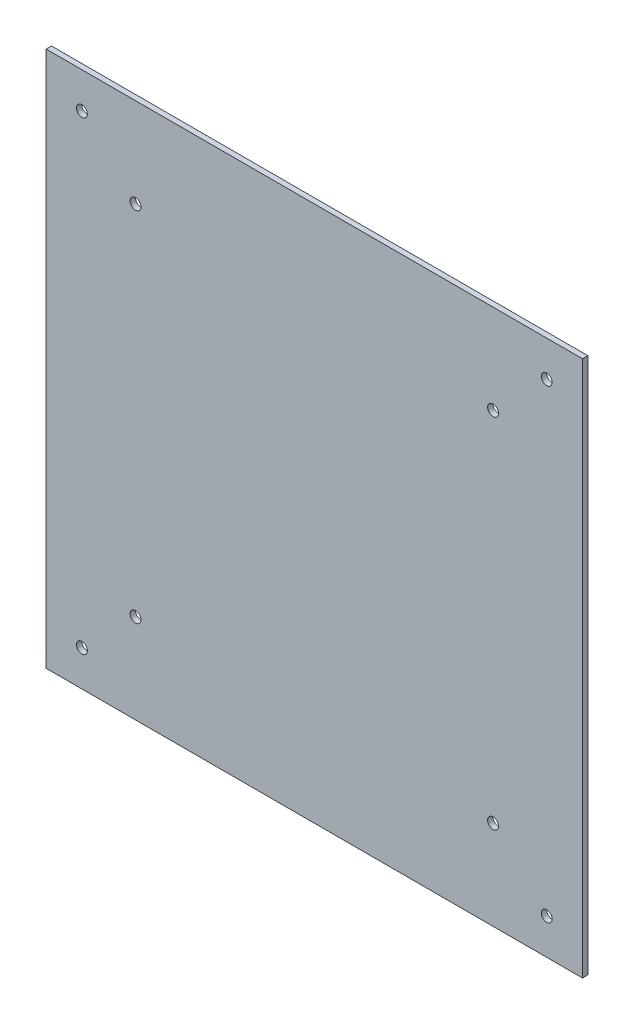
ISO-10303-21;
HEADER;
FILE_DESCRIPTION(('STEP AP214'),'2;1');
FILE_NAME('part.step','',(''),(''),'','','');
FILE_SCHEMA(('AUTOMOTIVE_DESIGN { 1 0 10303 214 1 1 1 1 }'));
ENDSEC;
DATA;
#1=APPLICATION_CONTEXT('core data for automotive mechanical design processes');
#2=APPLICATION_PROTOCOL_DEFINITION('international standard','automotive_design',2000,#1);
#3=PRODUCT_CONTEXT('',#1,'mechanical');
#4=PRODUCT('Part','Part','',(#3));
#5=PRODUCT_RELATED_PRODUCT_CATEGORY('part','',(#4));
#6=PRODUCT_DEFINITION_FORMATION('','',#4);
#7=PRODUCT_DEFINITION_CONTEXT('part definition',#1,'design');
#8=PRODUCT_DEFINITION('design','',#6,#7);
#9=PRODUCT_DEFINITION_SHAPE('','',#8);
#10=(LENGTH_UNIT() NAMED_UNIT(*) SI_UNIT(.MILLI.,.METRE.));
#11=(NAMED_UNIT(*) PLANE_ANGLE_UNIT() SI_UNIT($,.RADIAN.));
#12=(NAMED_UNIT(*) SI_UNIT($,.STERADIAN.) SOLID_ANGLE_UNIT());
#13=UNCERTAINTY_MEASURE_WITH_UNIT(LENGTH_MEASURE(1.E-05),#10,'distance_accuracy_value','');
#14=(GEOMETRIC_REPRESENTATION_CONTEXT(3) GLOBAL_UNCERTAINTY_ASSIGNED_CONTEXT((#13)) GLOBAL_UNIT_ASSIGNED_CONTEXT((#10,
#11,#12)) REPRESENTATION_CONTEXT('',''));
#15=CARTESIAN_POINT('',(0.,0.,0.));
#16=DIRECTION('',(0.,0.,1.));
#17=DIRECTION('',(1.,0.,0.));
#18=AXIS2_PLACEMENT_3D('',#15,#16,#17);
#19=CARTESIAN_POINT('',(150.,150.,3.));
#20=DIRECTION('',(-1.,0.,0.));
#21=DIRECTION('',(0.,0.,1.));
#22=AXIS2_PLACEMENT_3D('',#19,#20,#21);
#23=PLANE('',#22);
#24=DIRECTION('',(0.,1.,0.));
#25=VECTOR('',#24,1.);
#26=CARTESIAN_POINT('',(150.,150.,0.));
#27=LINE('',#26,#25);
#28=CARTESIAN_POINT('',(150.,-150.,0.));
#29=VERTEX_POINT('',#28);
#30=CARTESIAN_POINT('',(150.,150.,0.));
#31=VERTEX_POINT('',#30);
#32=EDGE_CURVE('E110',#29,#31,#27,.T.);
#33=ORIENTED_EDGE('',*,*,#32,.T.);
#34=DIRECTION('',(0.,0.,-1.));
#35=VECTOR('',#34,1.);
#36=CARTESIAN_POINT('',(150.,150.,3.));
#37=LINE('',#36,#35);
#38=CARTESIAN_POINT('',(150.,150.,3.));
#39=VERTEX_POINT('',#38);
#40=EDGE_CURVE('E11',#39,#31,#37,.T.);
#41=ORIENTED_EDGE('',*,*,#40,.F.);
#42=DIRECTION('',(0.,1.,0.));
#43=VECTOR('',#42,1.);
#44=CARTESIAN_POINT('',(150.,150.,3.));
#45=LINE('',#44,#43);
#46=CARTESIAN_POINT('',(150.,-150.,3.));
#47=VERTEX_POINT('',#46);
#48=EDGE_CURVE('E93',#47,#39,#45,.T.);
#49=ORIENTED_EDGE('',*,*,#48,.F.);
#50=DIRECTION('',(0.,0.,-1.));
#51=VECTOR('',#50,1.);
#52=CARTESIAN_POINT('',(150.,-150.,3.));
#53=LINE('',#52,#51);
#54=EDGE_CURVE('E106',#47,#29,#53,.T.);
#55=ORIENTED_EDGE('',*,*,#54,.T.);
#56=EDGE_LOOP('',(#33,#41,#49,#55));
#57=FACE_BOUND('',#56,.T.);
#58=ADVANCED_FACE('F39',(#57),#23,.F.);
#59=CARTESIAN_POINT('',(-150.,150.,3.));
#60=DIRECTION('',(0.,-1.,0.));
#61=DIRECTION('',(0.,0.,-1.));
#62=AXIS2_PLACEMENT_3D('',#59,#60,#61);
#63=PLANE('',#62);
#64=DIRECTION('',(-1.,0.,0.));
#65=VECTOR('',#64,1.);
#66=CARTESIAN_POINT('',(-150.,150.,0.));
#67=LINE('',#66,#65);
#68=CARTESIAN_POINT('',(-150.,150.,0.));
#69=VERTEX_POINT('',#68);
#70=EDGE_CURVE('E98',#31,#69,#67,.T.);
#71=ORIENTED_EDGE('',*,*,#70,.T.);
#72=DIRECTION('',(0.,0.,-1.));
#73=VECTOR('',#72,1.);
#74=CARTESIAN_POINT('',(-150.,150.,3.));
#75=LINE('',#74,#73);
#76=CARTESIAN_POINT('',(-150.,150.,3.));
#77=VERTEX_POINT('',#76);
#78=EDGE_CURVE('E49',#77,#69,#75,.T.);
#79=ORIENTED_EDGE('',*,*,#78,.F.);
#80=DIRECTION('',(-1.,0.,0.));
#81=VECTOR('',#80,1.);
#82=CARTESIAN_POINT('',(-150.,150.,3.));
#83=LINE('',#82,#81);
#84=EDGE_CURVE('E88',#39,#77,#83,.T.);
#85=ORIENTED_EDGE('',*,*,#84,.F.);
#86=ORIENTED_EDGE('',*,*,#40,.T.);
#87=EDGE_LOOP('',(#71,#79,#85,#86));
#88=FACE_BOUND('',#87,.T.);
#89=ADVANCED_FACE('F97',(#88),#63,.F.);
#90=CARTESIAN_POINT('',(-150.,150.,3.));
#91=DIRECTION('',(1.,0.,0.));
#92=DIRECTION('',(0.,0.,-1.));
#93=AXIS2_PLACEMENT_3D('',#90,#91,#92);
#94=PLANE('',#93);
#95=DIRECTION('',(0.,-1.,0.));
#96=VECTOR('',#95,1.);
#97=CARTESIAN_POINT('',(-150.,150.,0.));
#98=LINE('',#97,#96);
#99=CARTESIAN_POINT('',(-150.,-150.,0.));
#100=VERTEX_POINT('',#99);
#101=EDGE_CURVE('E75',#69,#100,#98,.T.);
#102=ORIENTED_EDGE('',*,*,#101,.T.);
#103=DIRECTION('',(0.,0.,-1.));
#104=VECTOR('',#103,1.);
#105=CARTESIAN_POINT('',(-150.,-150.,3.));
#106=LINE('',#105,#104);
#107=CARTESIAN_POINT('',(-150.,-150.,3.));
#108=VERTEX_POINT('',#107);
#109=EDGE_CURVE('E100',#108,#100,#106,.T.);
#110=ORIENTED_EDGE('',*,*,#109,.F.);
#111=DIRECTION('',(0.,-1.,0.));
#112=VECTOR('',#111,1.);
#113=CARTESIAN_POINT('',(-150.,150.,3.));
#114=LINE('',#113,#112);
#115=EDGE_CURVE('E91',#77,#108,#114,.T.);
#116=ORIENTED_EDGE('',*,*,#115,.F.);
#117=ORIENTED_EDGE('',*,*,#78,.T.);
#118=EDGE_LOOP('',(#102,#110,#116,#117));
#119=FACE_BOUND('',#118,.T.);
#120=ADVANCED_FACE('F102',(#119),#94,.F.);
#121=CARTESIAN_POINT('',(-150.,-150.,3.));
#122=DIRECTION('',(0.,1.,0.));
#123=DIRECTION('',(0.,0.,1.));
#124=AXIS2_PLACEMENT_3D('',#121,#122,#123);
#125=PLANE('',#124);
#126=DIRECTION('',(1.,0.,0.));
#127=VECTOR('',#126,1.);
#128=CARTESIAN_POINT('',(-150.,-150.,0.));
#129=LINE('',#128,#127);
#130=EDGE_CURVE('E81',#100,#29,#129,.T.);
#131=ORIENTED_EDGE('',*,*,#130,.T.);
#132=ORIENTED_EDGE('',*,*,#54,.F.);
#133=DIRECTION('',(1.,0.,0.));
#134=VECTOR('',#133,1.);
#135=CARTESIAN_POINT('',(-150.,-150.,3.));
#136=LINE('',#135,#134);
#137=EDGE_CURVE('E58',#108,#47,#136,.T.);
#138=ORIENTED_EDGE('',*,*,#137,.F.);
#139=ORIENTED_EDGE('',*,*,#109,.T.);
#140=EDGE_LOOP('',(#131,#132,#138,#139));
#141=FACE_BOUND('',#140,.T.);
#142=ADVANCED_FACE('F199',(#141),#125,.F.);
#143=CARTESIAN_POINT('',(0.,0.,3.));
#144=DIRECTION('',(0.,0.,1.));
#145=DIRECTION('',(1.,0.,0.));
#146=AXIS2_PLACEMENT_3D('',#143,#144,#145);
#147=PLANE('',#146);
#148=CARTESIAN_POINT('',(-130.,-130.,3.));
#149=DIRECTION('',(0.,0.,1.));
#150=DIRECTION('',(1.,0.,0.));
#151=AXIS2_PLACEMENT_3D('',#148,#149,#150);
#152=CIRCLE('',#151,3.05);
#153=CARTESIAN_POINT('',(-126.95,-130.,3.));
#154=VERTEX_POINT('',#153);
#155=EDGE_CURVE('E309',#154,#154,#152,.T.);
#156=ORIENTED_EDGE('',*,*,#155,.F.);
#157=EDGE_LOOP('',(#156));
#158=FACE_BOUND('',#157,.T.);
#159=CARTESIAN_POINT('',(-100.,-100.,3.));
#160=DIRECTION('',(0.,0.,1.));
#161=DIRECTION('',(1.,0.,0.));
#162=AXIS2_PLACEMENT_3D('',#159,#160,#161);
#163=CIRCLE('',#162,3.05);
#164=CARTESIAN_POINT('',(-96.95,-100.,3.));
#165=VERTEX_POINT('',#164);
#166=EDGE_CURVE('E313',#165,#165,#163,.T.);
#167=ORIENTED_EDGE('',*,*,#166,.F.);
#168=EDGE_LOOP('',(#167));
#169=FACE_BOUND('',#168,.T.);
#170=CARTESIAN_POINT('',(130.,-130.,3.));
#171=DIRECTION('',(0.,0.,1.));
#172=DIRECTION('',(1.,0.,0.));
#173=AXIS2_PLACEMENT_3D('',#170,#171,#172);
#174=CIRCLE('',#173,3.05);
#175=CARTESIAN_POINT('',(133.05,-130.,3.));
#176=VERTEX_POINT('',#175);
#177=EDGE_CURVE('E149',#176,#176,#174,.T.);
#178=ORIENTED_EDGE('',*,*,#177,.F.);
#179=EDGE_LOOP('',(#178));
#180=FACE_BOUND('',#179,.T.);
#181=CARTESIAN_POINT('',(100.,-100.,3.));
#182=DIRECTION('',(0.,0.,1.));
#183=DIRECTION('',(1.,0.,0.));
#184=AXIS2_PLACEMENT_3D('',#181,#182,#183);
#185=CIRCLE('',#184,3.05);
#186=CARTESIAN_POINT('',(103.05,-100.,3.));
#187=VERTEX_POINT('',#186);
#188=EDGE_CURVE('E134',#187,#187,#185,.T.);
#189=ORIENTED_EDGE('',*,*,#188,.F.);
#190=EDGE_LOOP('',(#189));
#191=FACE_BOUND('',#190,.T.);
#192=CARTESIAN_POINT('',(130.,130.,3.));
#193=DIRECTION('',(0.,0.,1.));
#194=DIRECTION('',(1.,0.,0.));
#195=AXIS2_PLACEMENT_3D('',#192,#193,#194);
#196=CIRCLE('',#195,3.05);
#197=CARTESIAN_POINT('',(133.05,130.,3.));
#198=VERTEX_POINT('',#197);
#199=EDGE_CURVE('E133',#198,#198,#196,.T.);
#200=ORIENTED_EDGE('',*,*,#199,.F.);
#201=EDGE_LOOP('',(#200));
#202=FACE_BOUND('',#201,.T.);
#203=CARTESIAN_POINT('',(-100.,100.,3.));
#204=DIRECTION('',(0.,0.,1.));
#205=DIRECTION('',(1.,0.,0.));
#206=AXIS2_PLACEMENT_3D('',#203,#204,#205);
#207=CIRCLE('',#206,3.05);
#208=CARTESIAN_POINT('',(-96.95,100.,3.));
#209=VERTEX_POINT('',#208);
#210=EDGE_CURVE('E129',#209,#209,#207,.T.);
#211=ORIENTED_EDGE('',*,*,#210,.F.);
#212=EDGE_LOOP('',(#211));
#213=FACE_BOUND('',#212,.T.);
#214=CARTESIAN_POINT('',(-130.,130.,3.));
#215=DIRECTION('',(0.,0.,1.));
#216=DIRECTION('',(1.,0.,0.));
#217=AXIS2_PLACEMENT_3D('',#214,#215,#216);
#218=CIRCLE('',#217,3.05);
#219=CARTESIAN_POINT('',(-126.95,130.,3.));
#220=VERTEX_POINT('',#219);
#221=EDGE_CURVE('E128',#220,#220,#218,.T.);
#222=ORIENTED_EDGE('',*,*,#221,.F.);
#223=EDGE_LOOP('',(#222));
#224=FACE_BOUND('',#223,.T.);
#225=CARTESIAN_POINT('',(100.,100.,3.));
#226=DIRECTION('',(0.,0.,1.));
#227=DIRECTION('',(1.,0.,0.));
#228=AXIS2_PLACEMENT_3D('',#225,#226,#227);
#229=CIRCLE('',#228,3.05);
#230=CARTESIAN_POINT('',(103.05,100.,3.));
#231=VERTEX_POINT('',#230);
#232=EDGE_CURVE('E166',#231,#231,#229,.T.);
#233=ORIENTED_EDGE('',*,*,#232,.F.);
#234=EDGE_LOOP('',(#233));
#235=FACE_BOUND('',#234,.T.);
#236=ORIENTED_EDGE('',*,*,#48,.T.);
#237=ORIENTED_EDGE('',*,*,#84,.T.);
#238=ORIENTED_EDGE('',*,*,#115,.T.);
#239=ORIENTED_EDGE('',*,*,#137,.T.);
#240=EDGE_LOOP('',(#236,#237,#238,#239));
#241=FACE_BOUND('',#240,.T.);
#242=ADVANCED_FACE('F89',(#158,#169,#180,#191,#202,#213,#224,#235,#241),#147,.T.);
#243=CARTESIAN_POINT('',(0.,0.,0.));
#244=DIRECTION('',(0.,0.,1.));
#245=DIRECTION('',(1.,0.,0.));
#246=AXIS2_PLACEMENT_3D('',#243,#244,#245);
#247=PLANE('',#246);
#248=CARTESIAN_POINT('',(-130.,-130.,0.));
#249=DIRECTION('',(0.,0.,1.));
#250=DIRECTION('',(1.,0.,0.));
#251=AXIS2_PLACEMENT_3D('',#248,#249,#250);
#252=CIRCLE('',#251,3.05);
#253=CARTESIAN_POINT('',(-126.95,-130.,0.));
#254=VERTEX_POINT('',#253);
#255=EDGE_CURVE('E42',#254,#254,#252,.T.);
#256=ORIENTED_EDGE('',*,*,#255,.T.);
#257=EDGE_LOOP('',(#256));
#258=FACE_BOUND('',#257,.T.);
#259=CARTESIAN_POINT('',(-100.,-100.,0.));
#260=DIRECTION('',(0.,0.,1.));
#261=DIRECTION('',(1.,0.,0.));
#262=AXIS2_PLACEMENT_3D('',#259,#260,#261);
#263=CIRCLE('',#262,3.05);
#264=CARTESIAN_POINT('',(-96.95,-100.,0.));
#265=VERTEX_POINT('',#264);
#266=EDGE_CURVE('E317',#265,#265,#263,.T.);
#267=ORIENTED_EDGE('',*,*,#266,.T.);
#268=EDGE_LOOP('',(#267));
#269=FACE_BOUND('',#268,.T.);
#270=CARTESIAN_POINT('',(130.,-130.,0.));
#271=DIRECTION('',(0.,0.,1.));
#272=DIRECTION('',(1.,0.,0.));
#273=AXIS2_PLACEMENT_3D('',#270,#271,#272);
#274=CIRCLE('',#273,3.05);
#275=CARTESIAN_POINT('',(133.05,-130.,0.));
#276=VERTEX_POINT('',#275);
#277=EDGE_CURVE('E143',#276,#276,#274,.T.);
#278=ORIENTED_EDGE('',*,*,#277,.T.);
#279=EDGE_LOOP('',(#278));
#280=FACE_BOUND('',#279,.T.);
#281=CARTESIAN_POINT('',(100.,-100.,0.));
#282=DIRECTION('',(0.,0.,1.));
#283=DIRECTION('',(1.,0.,0.));
#284=AXIS2_PLACEMENT_3D('',#281,#282,#283);
#285=CIRCLE('',#284,3.05);
#286=CARTESIAN_POINT('',(103.05,-100.,0.));
#287=VERTEX_POINT('',#286);
#288=EDGE_CURVE('E130',#287,#287,#285,.T.);
#289=ORIENTED_EDGE('',*,*,#288,.T.);
#290=EDGE_LOOP('',(#289));
#291=FACE_BOUND('',#290,.T.);
#292=CARTESIAN_POINT('',(130.,130.,0.));
#293=DIRECTION('',(0.,0.,1.));
#294=DIRECTION('',(1.,0.,0.));
#295=AXIS2_PLACEMENT_3D('',#292,#293,#294);
#296=CIRCLE('',#295,3.05);
#297=CARTESIAN_POINT('',(133.05,130.,0.));
#298=VERTEX_POINT('',#297);
#299=EDGE_CURVE('E140',#298,#298,#296,.T.);
#300=ORIENTED_EDGE('',*,*,#299,.T.);
#301=EDGE_LOOP('',(#300));
#302=FACE_BOUND('',#301,.T.);
#303=CARTESIAN_POINT('',(-100.,100.,0.));
#304=DIRECTION('',(0.,0.,1.));
#305=DIRECTION('',(1.,0.,0.));
#306=AXIS2_PLACEMENT_3D('',#303,#304,#305);
#307=CIRCLE('',#306,3.05);
#308=CARTESIAN_POINT('',(-96.95,100.,0.));
#309=VERTEX_POINT('',#308);
#310=EDGE_CURVE('E125',#309,#309,#307,.T.);
#311=ORIENTED_EDGE('',*,*,#310,.T.);
#312=EDGE_LOOP('',(#311));
#313=FACE_BOUND('',#312,.T.);
#314=CARTESIAN_POINT('',(-130.,130.,0.));
#315=DIRECTION('',(0.,0.,1.));
#316=DIRECTION('',(1.,0.,0.));
#317=AXIS2_PLACEMENT_3D('',#314,#315,#316);
#318=CIRCLE('',#317,3.05);
#319=CARTESIAN_POINT('',(-126.95,130.,0.));
#320=VERTEX_POINT('',#319);
#321=EDGE_CURVE('E162',#320,#320,#318,.T.);
#322=ORIENTED_EDGE('',*,*,#321,.T.);
#323=EDGE_LOOP('',(#322));
#324=FACE_BOUND('',#323,.T.);
#325=CARTESIAN_POINT('',(100.,100.,0.));
#326=DIRECTION('',(0.,0.,1.));
#327=DIRECTION('',(1.,0.,0.));
#328=AXIS2_PLACEMENT_3D('',#325,#326,#327);
#329=CIRCLE('',#328,3.05);
#330=CARTESIAN_POINT('',(103.05,100.,0.));
#331=VERTEX_POINT('',#330);
#332=EDGE_CURVE('E114',#331,#331,#329,.T.);
#333=ORIENTED_EDGE('',*,*,#332,.T.);
#334=EDGE_LOOP('',(#333));
#335=FACE_BOUND('',#334,.T.);
#336=ORIENTED_EDGE('',*,*,#32,.F.);
#337=ORIENTED_EDGE('',*,*,#130,.F.);
#338=ORIENTED_EDGE('',*,*,#101,.F.);
#339=ORIENTED_EDGE('',*,*,#70,.F.);
#340=EDGE_LOOP('',(#336,#337,#338,#339));
#341=FACE_BOUND('',#340,.T.);
#342=ADVANCED_FACE('F175',(#258,#269,#280,#291,#302,#313,#324,#335,#341),#247,.F.);
#343=CARTESIAN_POINT('',(100.,100.,3.));
#344=DIRECTION('',(0.,0.,1.));
#345=DIRECTION('',(1.,0.,0.));
#346=AXIS2_PLACEMENT_3D('',#343,#344,#345);
#347=CYLINDRICAL_SURFACE('',#346,3.05);
#348=ORIENTED_EDGE('',*,*,#232,.T.);
#349=EDGE_LOOP('',(#348));
#350=FACE_BOUND('',#349,.T.);
#351=ORIENTED_EDGE('',*,*,#332,.F.);
#352=EDGE_LOOP('',(#351));
#353=FACE_BOUND('',#352,.T.);
#354=ADVANCED_FACE('F178',(#350,#353),#347,.F.);
#355=CARTESIAN_POINT('',(-130.,130.,3.));
#356=DIRECTION('',(0.,0.,1.));
#357=DIRECTION('',(1.,0.,0.));
#358=AXIS2_PLACEMENT_3D('',#355,#356,#357);
#359=CYLINDRICAL_SURFACE('',#358,3.05);
#360=ORIENTED_EDGE('',*,*,#221,.T.);
#361=EDGE_LOOP('',(#360));
#362=FACE_BOUND('',#361,.T.);
#363=ORIENTED_EDGE('',*,*,#321,.F.);
#364=EDGE_LOOP('',(#363));
#365=FACE_BOUND('',#364,.T.);
#366=ADVANCED_FACE('F180',(#362,#365),#359,.F.);
#367=CARTESIAN_POINT('',(-100.,100.,3.));
#368=DIRECTION('',(0.,0.,1.));
#369=DIRECTION('',(1.,0.,0.));
#370=AXIS2_PLACEMENT_3D('',#367,#368,#369);
#371=CYLINDRICAL_SURFACE('',#370,3.05);
#372=ORIENTED_EDGE('',*,*,#210,.T.);
#373=EDGE_LOOP('',(#372));
#374=FACE_BOUND('',#373,.T.);
#375=ORIENTED_EDGE('',*,*,#310,.F.);
#376=EDGE_LOOP('',(#375));
#377=FACE_BOUND('',#376,.T.);
#378=ADVANCED_FACE('F187',(#374,#377),#371,.F.);
#379=CARTESIAN_POINT('',(130.,130.,3.));
#380=DIRECTION('',(0.,0.,1.));
#381=DIRECTION('',(1.,0.,0.));
#382=AXIS2_PLACEMENT_3D('',#379,#380,#381);
#383=CYLINDRICAL_SURFACE('',#382,3.05);
#384=ORIENTED_EDGE('',*,*,#199,.T.);
#385=EDGE_LOOP('',(#384));
#386=FACE_BOUND('',#385,.T.);
#387=ORIENTED_EDGE('',*,*,#299,.F.);
#388=EDGE_LOOP('',(#387));
#389=FACE_BOUND('',#388,.T.);
#390=ADVANCED_FACE('F253',(#386,#389),#383,.F.);
#391=CARTESIAN_POINT('',(100.,-100.,3.));
#392=DIRECTION('',(0.,0.,1.));
#393=DIRECTION('',(1.,0.,0.));
#394=AXIS2_PLACEMENT_3D('',#391,#392,#393);
#395=CYLINDRICAL_SURFACE('',#394,3.05);
#396=ORIENTED_EDGE('',*,*,#188,.T.);
#397=EDGE_LOOP('',(#396));
#398=FACE_BOUND('',#397,.T.);
#399=ORIENTED_EDGE('',*,*,#288,.F.);
#400=EDGE_LOOP('',(#399));
#401=FACE_BOUND('',#400,.T.);
#402=ADVANCED_FACE('F262',(#398,#401),#395,.F.);
#403=CARTESIAN_POINT('',(130.,-130.,3.));
#404=DIRECTION('',(0.,0.,1.));
#405=DIRECTION('',(1.,0.,0.));
#406=AXIS2_PLACEMENT_3D('',#403,#404,#405);
#407=CYLINDRICAL_SURFACE('',#406,3.05);
#408=ORIENTED_EDGE('',*,*,#177,.T.);
#409=EDGE_LOOP('',(#408));
#410=FACE_BOUND('',#409,.T.);
#411=ORIENTED_EDGE('',*,*,#277,.F.);
#412=EDGE_LOOP('',(#411));
#413=FACE_BOUND('',#412,.T.);
#414=ADVANCED_FACE('F271',(#410,#413),#407,.F.);
#415=CARTESIAN_POINT('',(-100.,-100.,3.));
#416=DIRECTION('',(0.,0.,1.));
#417=DIRECTION('',(1.,0.,0.));
#418=AXIS2_PLACEMENT_3D('',#415,#416,#417);
#419=CYLINDRICAL_SURFACE('',#418,3.05);
#420=ORIENTED_EDGE('',*,*,#166,.T.);
#421=EDGE_LOOP('',(#420));
#422=FACE_BOUND('',#421,.T.);
#423=ORIENTED_EDGE('',*,*,#266,.F.);
#424=EDGE_LOOP('',(#423));
#425=FACE_BOUND('',#424,.T.);
#426=ADVANCED_FACE('F279',(#422,#425),#419,.F.);
#427=CARTESIAN_POINT('',(-130.,-130.,3.));
#428=DIRECTION('',(0.,0.,1.));
#429=DIRECTION('',(1.,0.,0.));
#430=AXIS2_PLACEMENT_3D('',#427,#428,#429);
#431=CYLINDRICAL_SURFACE('',#430,3.05);
#432=ORIENTED_EDGE('',*,*,#155,.T.);
#433=EDGE_LOOP('',(#432));
#434=FACE_BOUND('',#433,.T.);
#435=ORIENTED_EDGE('',*,*,#255,.F.);
#436=EDGE_LOOP('',(#435));
#437=FACE_BOUND('',#436,.T.);
#438=ADVANCED_FACE('F288',(#434,#437),#431,.F.);
#439=CLOSED_SHELL('',(#58,#89,#120,#142,#242,#342,#354,#366,#378,#390,#402,#414,#426,#438));
#440=MANIFOLD_SOLID_BREP('B2',#439);
#441=ADVANCED_BREP_SHAPE_REPRESENTATION('',(#18,#440),#14);
#442=SHAPE_DEFINITION_REPRESENTATION(#9,#441);
ENDSEC;
END-ISO-10303-21;
